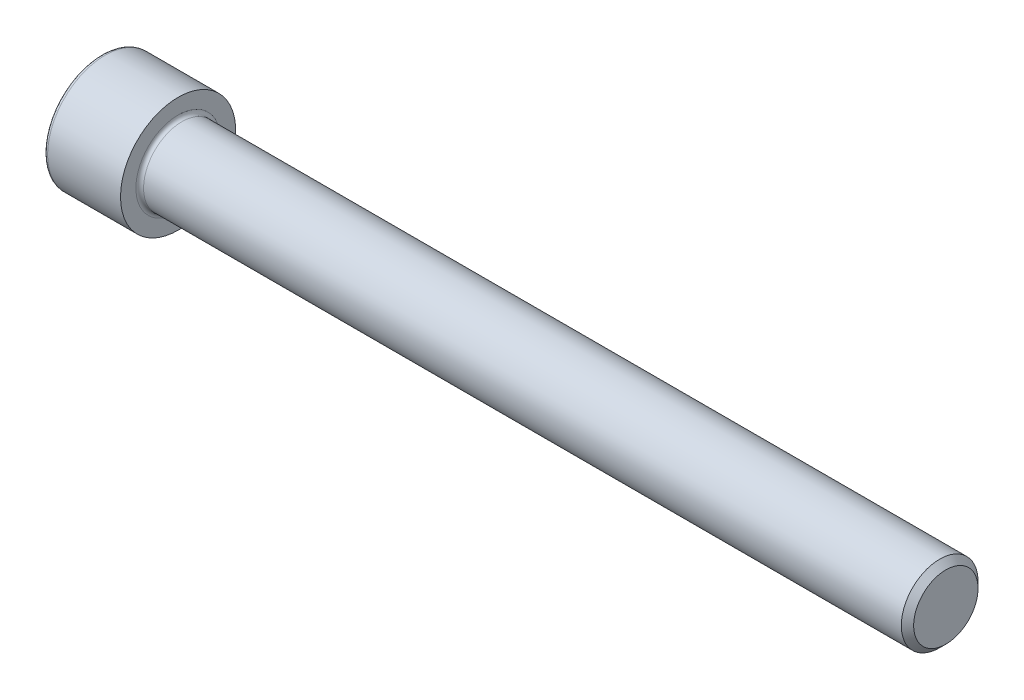
ISO-10303-21;
HEADER;
FILE_DESCRIPTION(('STEP AP214'),'2;1');
FILE_NAME('part.step','',(''),(''),'','','');
FILE_SCHEMA(('AUTOMOTIVE_DESIGN { 1 0 10303 214 1 1 1 1 }'));
ENDSEC;
DATA;
#1=APPLICATION_CONTEXT('core data for automotive mechanical design processes');
#2=APPLICATION_PROTOCOL_DEFINITION('international standard','automotive_design',2000,#1);
#3=PRODUCT_CONTEXT('',#1,'mechanical');
#4=PRODUCT('Part','Part','',(#3));
#5=PRODUCT_RELATED_PRODUCT_CATEGORY('part','',(#4));
#6=PRODUCT_DEFINITION_FORMATION('','',#4);
#7=PRODUCT_DEFINITION_CONTEXT('part definition',#1,'design');
#8=PRODUCT_DEFINITION('design','',#6,#7);
#9=PRODUCT_DEFINITION_SHAPE('','',#8);
#10=(LENGTH_UNIT() NAMED_UNIT(*) SI_UNIT(.MILLI.,.METRE.));
#11=(NAMED_UNIT(*) PLANE_ANGLE_UNIT() SI_UNIT($,.RADIAN.));
#12=(NAMED_UNIT(*) SI_UNIT($,.STERADIAN.) SOLID_ANGLE_UNIT());
#13=UNCERTAINTY_MEASURE_WITH_UNIT(LENGTH_MEASURE(1.E-05),#10,'distance_accuracy_value','');
#14=(GEOMETRIC_REPRESENTATION_CONTEXT(3) GLOBAL_UNCERTAINTY_ASSIGNED_CONTEXT((#13)) GLOBAL_UNIT_ASSIGNED_CONTEXT((#10,
#11,#12)) REPRESENTATION_CONTEXT('',''));
#15=CARTESIAN_POINT('',(0.,0.,0.));
#16=DIRECTION('',(0.,0.,1.));
#17=DIRECTION('',(1.,0.,0.));
#18=AXIS2_PLACEMENT_3D('',#15,#16,#17);
#19=CARTESIAN_POINT('',(0.,0.,0.));
#20=DIRECTION('',(-1.,0.,0.));
#21=DIRECTION('',(0.,0.,1.));
#22=AXIS2_PLACEMENT_3D('',#19,#20,#21);
#23=PLANE('',#22);
#24=DIRECTION('',(0.,-0.499999999999998,0.866025403784439));
#25=VECTOR('',#24,1.);
#26=CARTESIAN_POINT('',(0.,5.83989797285307,0.));
#27=LINE('',#26,#25);
#28=CARTESIAN_POINT('',(0.,5.83989797285307,0.));
#29=VERTEX_POINT('',#28);
#30=CARTESIAN_POINT('',(0.,2.91994898642654,5.0575));
#31=VERTEX_POINT('',#30);
#32=EDGE_CURVE('E262',#29,#31,#27,.T.);
#33=ORIENTED_EDGE('',*,*,#32,.T.);
#34=DIRECTION('',(0.,1.,0.));
#35=VECTOR('',#34,1.);
#36=CARTESIAN_POINT('',(0.,-2.91994898642652,5.0575));
#37=LINE('',#36,#35);
#38=CARTESIAN_POINT('',(0.,-2.91994898642652,5.0575));
#39=VERTEX_POINT('',#38);
#40=EDGE_CURVE('E134',#39,#31,#37,.T.);
#41=ORIENTED_EDGE('',*,*,#40,.F.);
#42=DIRECTION('',(0.,-0.500000000000001,-0.866025403784438));
#43=VECTOR('',#42,1.);
#44=CARTESIAN_POINT('',(0.,-2.91994898642652,5.0575));
#45=LINE('',#44,#43);
#46=CARTESIAN_POINT('',(0.,-5.83989797285306,0.));
#47=VERTEX_POINT('',#46);
#48=EDGE_CURVE('E265',#39,#47,#45,.T.);
#49=ORIENTED_EDGE('',*,*,#48,.T.);
#50=DIRECTION('',(0.,0.499999999999998,-0.86602540378444));
#51=VECTOR('',#50,1.);
#52=CARTESIAN_POINT('',(0.,-5.83989797285306,0.));
#53=LINE('',#52,#51);
#54=CARTESIAN_POINT('',(0.,-2.91994898642653,-5.0575));
#55=VERTEX_POINT('',#54);
#56=EDGE_CURVE('E268',#47,#55,#53,.T.);
#57=ORIENTED_EDGE('',*,*,#56,.T.);
#58=DIRECTION('',(0.,-1.,0.));
#59=VECTOR('',#58,1.);
#60=CARTESIAN_POINT('',(0.,2.91994898642653,-5.0575));
#61=LINE('',#60,#59);
#62=CARTESIAN_POINT('',(0.,2.91994898642653,-5.0575));
#63=VERTEX_POINT('',#62);
#64=EDGE_CURVE('E271',#63,#55,#61,.T.);
#65=ORIENTED_EDGE('',*,*,#64,.F.);
#66=DIRECTION('',(0.,-0.500000000000001,-0.866025403784438));
#67=VECTOR('',#66,1.);
#68=CARTESIAN_POINT('',(0.,5.83989797285307,0.));
#69=LINE('',#68,#67);
#70=EDGE_CURVE('E129',#29,#63,#69,.T.);
#71=ORIENTED_EDGE('',*,*,#70,.F.);
#72=EDGE_LOOP('',(#33,#41,#49,#57,#65,#71));
#73=FACE_BOUND('',#72,.T.);
#74=CARTESIAN_POINT('',(0.,0.,0.));
#75=DIRECTION('',(-1.,0.,0.));
#76=DIRECTION('',(0.,0.,1.));
#77=AXIS2_PLACEMENT_3D('',#74,#75,#76);
#78=CIRCLE('',#77,8.4);
#79=CARTESIAN_POINT('',(0.,0.,8.4));
#80=VERTEX_POINT('',#79);
#81=EDGE_CURVE('E46',#80,#80,#78,.T.);
#82=ORIENTED_EDGE('',*,*,#81,.T.);
#83=EDGE_LOOP('',(#82));
#84=FACE_BOUND('',#83,.T.);
#85=ADVANCED_FACE('F38',(#73,#84),#23,.T.);
#86=CARTESIAN_POINT('',(-31.75,0.,0.));
#87=DIRECTION('',(-1.,0.,0.));
#88=DIRECTION('',(0.,0.,1.));
#89=AXIS2_PLACEMENT_3D('',#86,#87,#88);
#90=CYLINDRICAL_SURFACE('',#89,9.);
#91=CARTESIAN_POINT('',(0.600000000000003,0.,0.));
#92=DIRECTION('',(-1.,0.,0.));
#93=DIRECTION('',(0.,0.,1.));
#94=AXIS2_PLACEMENT_3D('',#91,#92,#93);
#95=CIRCLE('',#94,9.);
#96=CARTESIAN_POINT('',(0.600000000000003,0.,9.));
#97=VERTEX_POINT('',#96);
#98=EDGE_CURVE('E11',#97,#97,#95,.F.);
#99=ORIENTED_EDGE('',*,*,#98,.T.);
#100=EDGE_LOOP('',(#99));
#101=FACE_BOUND('',#100,.T.);
#102=CARTESIAN_POINT('',(12.,0.,0.));
#103=DIRECTION('',(-1.,0.,0.));
#104=DIRECTION('',(0.,0.,1.));
#105=AXIS2_PLACEMENT_3D('',#102,#103,#104);
#106=CIRCLE('',#105,9.);
#107=CARTESIAN_POINT('',(12.,0.,9.));
#108=VERTEX_POINT('',#107);
#109=EDGE_CURVE('E152',#108,#108,#106,.T.);
#110=ORIENTED_EDGE('',*,*,#109,.T.);
#111=EDGE_LOOP('',(#110));
#112=FACE_BOUND('',#111,.T.);
#113=ADVANCED_FACE('F176',(#101,#112),#90,.T.);
#114=CARTESIAN_POINT('',(12.,9.,0.));
#115=DIRECTION('',(1.,0.,0.));
#116=DIRECTION('',(0.,0.,-1.));
#117=AXIS2_PLACEMENT_3D('',#114,#115,#116);
#118=PLANE('',#117);
#119=CARTESIAN_POINT('',(12.,0.,0.));
#120=DIRECTION('',(1.,0.,0.));
#121=DIRECTION('',(0.,0.,-1.));
#122=AXIS2_PLACEMENT_3D('',#119,#120,#121);
#123=CIRCLE('',#122,6.6);
#124=CARTESIAN_POINT('',(12.,0.,-6.6));
#125=VERTEX_POINT('',#124);
#126=EDGE_CURVE('E155',#125,#125,#123,.F.);
#127=ORIENTED_EDGE('',*,*,#126,.T.);
#128=EDGE_LOOP('',(#127));
#129=FACE_BOUND('',#128,.T.);
#130=ORIENTED_EDGE('',*,*,#109,.F.);
#131=EDGE_LOOP('',(#130));
#132=FACE_BOUND('',#131,.T.);
#133=ADVANCED_FACE('F182',(#129,#132),#118,.T.);
#134=CARTESIAN_POINT('',(-31.75,0.,0.));
#135=DIRECTION('',(-1.,0.,0.));
#136=DIRECTION('',(0.,0.,1.));
#137=AXIS2_PLACEMENT_3D('',#134,#135,#136);
#138=CYLINDRICAL_SURFACE('',#137,6.);
#139=CARTESIAN_POINT('',(12.6,0.,0.));
#140=DIRECTION('',(1.,0.,0.));
#141=DIRECTION('',(0.,0.,-1.));
#142=AXIS2_PLACEMENT_3D('',#139,#140,#141);
#143=CIRCLE('',#142,6.);
#144=CARTESIAN_POINT('',(12.6,0.,-6.));
#145=VERTEX_POINT('',#144);
#146=EDGE_CURVE('E158',#145,#145,#143,.T.);
#147=ORIENTED_EDGE('',*,*,#146,.T.);
#148=EDGE_LOOP('',(#147));
#149=FACE_BOUND('',#148,.T.);
#150=CARTESIAN_POINT('',(131.036,0.,0.));
#151=DIRECTION('',(-1.,0.,0.));
#152=DIRECTION('',(0.,0.,1.));
#153=AXIS2_PLACEMENT_3D('',#150,#151,#152);
#154=CIRCLE('',#153,6.);
#155=CARTESIAN_POINT('',(131.036,0.,6.));
#156=VERTEX_POINT('',#155);
#157=EDGE_CURVE('E149',#156,#156,#154,.T.);
#158=ORIENTED_EDGE('',*,*,#157,.T.);
#159=EDGE_LOOP('',(#158));
#160=FACE_BOUND('',#159,.T.);
#161=ADVANCED_FACE('F188',(#149,#160),#138,.T.);
#162=CARTESIAN_POINT('',(132.,0.,0.));
#163=DIRECTION('',(-1.,0.,0.));
#164=DIRECTION('',(0.,0.,1.));
#165=AXIS2_PLACEMENT_3D('',#162,#163,#164);
#166=CONICAL_SURFACE('',#165,5.036,0.785398163397468);
#167=ORIENTED_EDGE('',*,*,#157,.F.);
#168=EDGE_LOOP('',(#167));
#169=FACE_BOUND('',#168,.T.);
#170=CARTESIAN_POINT('',(132.,0.,0.));
#171=DIRECTION('',(-1.,0.,0.));
#172=DIRECTION('',(0.,0.,1.));
#173=AXIS2_PLACEMENT_3D('',#170,#171,#172);
#174=CIRCLE('',#173,5.036);
#175=CARTESIAN_POINT('',(132.,0.,5.036));
#176=VERTEX_POINT('',#175);
#177=EDGE_CURVE('E145',#176,#176,#174,.T.);
#178=ORIENTED_EDGE('',*,*,#177,.T.);
#179=EDGE_LOOP('',(#178));
#180=FACE_BOUND('',#179,.T.);
#181=ADVANCED_FACE('F192',(#169,#180),#166,.T.);
#182=CARTESIAN_POINT('',(132.,5.036,0.));
#183=DIRECTION('',(1.,0.,0.));
#184=DIRECTION('',(0.,0.,-1.));
#185=AXIS2_PLACEMENT_3D('',#182,#183,#184);
#186=PLANE('',#185);
#187=ORIENTED_EDGE('',*,*,#177,.F.);
#188=EDGE_LOOP('',(#187));
#189=FACE_BOUND('',#188,.T.);
#190=ADVANCED_FACE('F172',(#189),#186,.T.);
#191=CARTESIAN_POINT('',(12.6,0.,0.));
#192=DIRECTION('',(1.,0.,0.));
#193=DIRECTION('',(0.,0.,-1.));
#194=AXIS2_PLACEMENT_3D('',#191,#192,#193);
#195=TOROIDAL_SURFACE('',#194,6.6,0.6);
#196=ORIENTED_EDGE('',*,*,#146,.F.);
#197=EDGE_LOOP('',(#196));
#198=FACE_BOUND('',#197,.T.);
#199=ORIENTED_EDGE('',*,*,#126,.F.);
#200=EDGE_LOOP('',(#199));
#201=FACE_BOUND('',#200,.T.);
#202=ADVANCED_FACE('F165',(#198,#201),#195,.F.);
#203=CARTESIAN_POINT('',(0.600000000000003,0.,0.));
#204=DIRECTION('',(-1.,0.,0.));
#205=DIRECTION('',(0.,0.,1.));
#206=AXIS2_PLACEMENT_3D('',#203,#204,#205);
#207=TOROIDAL_SURFACE('',#206,8.4,0.6);
#208=ORIENTED_EDGE('',*,*,#98,.F.);
#209=EDGE_LOOP('',(#208));
#210=FACE_BOUND('',#209,.T.);
#211=ORIENTED_EDGE('',*,*,#81,.F.);
#212=EDGE_LOOP('',(#211));
#213=FACE_BOUND('',#212,.T.);
#214=ADVANCED_FACE('F40',(#210,#213),#207,.T.);
#215=CARTESIAN_POINT('',(6.,5.83989797285307,0.));
#216=DIRECTION('',(0.,-0.866025403784439,-0.499999999999999));
#217=DIRECTION('',(0.,0.499999999999999,-0.866025403784439));
#218=AXIS2_PLACEMENT_3D('',#215,#216,#217);
#219=PLANE('',#218);
#220=ORIENTED_EDGE('',*,*,#32,.F.);
#221=DIRECTION('',(-1.,0.,0.));
#222=VECTOR('',#221,1.);
#223=CARTESIAN_POINT('',(6.,5.83989797285307,0.));
#224=LINE('',#223,#222);
#225=CARTESIAN_POINT('',(6.,5.83989797285307,0.));
#226=VERTEX_POINT('',#225);
#227=EDGE_CURVE('E252',#226,#29,#224,.T.);
#228=ORIENTED_EDGE('',*,*,#227,.F.);
#229=DIRECTION('',(0.,-0.499999999999998,0.866025403784439));
#230=VECTOR('',#229,1.);
#231=CARTESIAN_POINT('',(6.,5.83989797285307,0.));
#232=LINE('',#231,#230);
#233=CARTESIAN_POINT('',(6.,4.3799234796398,2.52874999999999));
#234=VERTEX_POINT('',#233);
#235=EDGE_CURVE('E121',#226,#234,#232,.T.);
#236=ORIENTED_EDGE('',*,*,#235,.T.);
#237=CARTESIAN_POINT('',(6.,2.91994898642654,5.0575));
#238=VERTEX_POINT('',#237);
#239=EDGE_CURVE('E112',#234,#238,#232,.T.);
#240=ORIENTED_EDGE('',*,*,#239,.T.);
#241=DIRECTION('',(-1.,0.,0.));
#242=VECTOR('',#241,1.);
#243=CARTESIAN_POINT('',(6.,2.91994898642654,5.0575));
#244=LINE('',#243,#242);
#245=EDGE_CURVE('E126',#238,#31,#244,.T.);
#246=ORIENTED_EDGE('',*,*,#245,.T.);
#247=EDGE_LOOP('',(#220,#228,#236,#240,#246));
#248=FACE_BOUND('',#247,.T.);
#249=ADVANCED_FACE('F125',(#248),#219,.T.);
#250=CARTESIAN_POINT('',(6.,-2.91994898642652,5.0575));
#251=DIRECTION('',(0.,0.,1.));
#252=DIRECTION('',(0.,-1.,0.));
#253=AXIS2_PLACEMENT_3D('',#250,#251,#252);
#254=PLANE('',#253);
#255=ORIENTED_EDGE('',*,*,#40,.T.);
#256=ORIENTED_EDGE('',*,*,#245,.F.);
#257=DIRECTION('',(0.,1.,0.));
#258=VECTOR('',#257,1.);
#259=CARTESIAN_POINT('',(6.,-2.91994898642652,5.0575));
#260=LINE('',#259,#258);
#261=CARTESIAN_POINT('',(6.,0.,5.0575));
#262=VERTEX_POINT('',#261);
#263=EDGE_CURVE('E109',#262,#238,#260,.T.);
#264=ORIENTED_EDGE('',*,*,#263,.F.);
#265=CARTESIAN_POINT('',(6.,-2.91994898642652,5.0575));
#266=VERTEX_POINT('',#265);
#267=EDGE_CURVE('E120',#266,#262,#260,.T.);
#268=ORIENTED_EDGE('',*,*,#267,.F.);
#269=DIRECTION('',(-1.,0.,0.));
#270=VECTOR('',#269,1.);
#271=CARTESIAN_POINT('',(6.,-2.91994898642652,5.0575));
#272=LINE('',#271,#270);
#273=EDGE_CURVE('E136',#266,#39,#272,.T.);
#274=ORIENTED_EDGE('',*,*,#273,.T.);
#275=EDGE_LOOP('',(#255,#256,#264,#268,#274));
#276=FACE_BOUND('',#275,.T.);
#277=ADVANCED_FACE('F131',(#276),#254,.F.);
#278=CARTESIAN_POINT('',(6.,-2.91994898642652,5.0575));
#279=DIRECTION('',(0.,0.866025403784438,-0.500000000000001));
#280=DIRECTION('',(0.,0.500000000000001,0.866025403784438));
#281=AXIS2_PLACEMENT_3D('',#278,#279,#280);
#282=PLANE('',#281);
#283=ORIENTED_EDGE('',*,*,#48,.F.);
#284=ORIENTED_EDGE('',*,*,#273,.F.);
#285=DIRECTION('',(0.,-0.500000000000001,-0.866025403784438));
#286=VECTOR('',#285,1.);
#287=CARTESIAN_POINT('',(6.,-2.91994898642652,5.0575));
#288=LINE('',#287,#286);
#289=CARTESIAN_POINT('',(6.,-4.37992347963979,2.52875));
#290=VERTEX_POINT('',#289);
#291=EDGE_CURVE('E291',#266,#290,#288,.T.);
#292=ORIENTED_EDGE('',*,*,#291,.T.);
#293=CARTESIAN_POINT('',(6.,-5.83989797285306,0.));
#294=VERTEX_POINT('',#293);
#295=EDGE_CURVE('E280',#290,#294,#288,.T.);
#296=ORIENTED_EDGE('',*,*,#295,.T.);
#297=DIRECTION('',(-1.,0.,0.));
#298=VECTOR('',#297,1.);
#299=CARTESIAN_POINT('',(6.,-5.83989797285306,0.));
#300=LINE('',#299,#298);
#301=EDGE_CURVE('E141',#294,#47,#300,.T.);
#302=ORIENTED_EDGE('',*,*,#301,.T.);
#303=EDGE_LOOP('',(#283,#284,#292,#296,#302));
#304=FACE_BOUND('',#303,.T.);
#305=ADVANCED_FACE('F206',(#304),#282,.T.);
#306=CARTESIAN_POINT('',(6.,-5.83989797285306,0.));
#307=DIRECTION('',(0.,0.86602540378444,0.499999999999998));
#308=DIRECTION('',(0.,-0.499999999999998,0.86602540378444));
#309=AXIS2_PLACEMENT_3D('',#306,#307,#308);
#310=PLANE('',#309);
#311=ORIENTED_EDGE('',*,*,#56,.F.);
#312=ORIENTED_EDGE('',*,*,#301,.F.);
#313=DIRECTION('',(0.,0.499999999999998,-0.86602540378444));
#314=VECTOR('',#313,1.);
#315=CARTESIAN_POINT('',(6.,-5.83989797285306,0.));
#316=LINE('',#315,#314);
#317=CARTESIAN_POINT('',(6.,-4.3799234796398,-2.52874999999999));
#318=VERTEX_POINT('',#317);
#319=EDGE_CURVE('E258',#294,#318,#316,.T.);
#320=ORIENTED_EDGE('',*,*,#319,.T.);
#321=CARTESIAN_POINT('',(6.,-2.91994898642653,-5.0575));
#322=VERTEX_POINT('',#321);
#323=EDGE_CURVE('E290',#318,#322,#316,.T.);
#324=ORIENTED_EDGE('',*,*,#323,.T.);
#325=DIRECTION('',(-1.,0.,0.));
#326=VECTOR('',#325,1.);
#327=CARTESIAN_POINT('',(6.,-2.91994898642653,-5.0575));
#328=LINE('',#327,#326);
#329=EDGE_CURVE('E251',#322,#55,#328,.T.);
#330=ORIENTED_EDGE('',*,*,#329,.T.);
#331=EDGE_LOOP('',(#311,#312,#320,#324,#330));
#332=FACE_BOUND('',#331,.T.);
#333=ADVANCED_FACE('F209',(#332),#310,.T.);
#334=CARTESIAN_POINT('',(6.,2.91994898642653,-5.0575));
#335=DIRECTION('',(0.,0.,-1.));
#336=DIRECTION('',(0.,1.,0.));
#337=AXIS2_PLACEMENT_3D('',#334,#335,#336);
#338=PLANE('',#337);
#339=ORIENTED_EDGE('',*,*,#64,.T.);
#340=ORIENTED_EDGE('',*,*,#329,.F.);
#341=DIRECTION('',(0.,-1.,0.));
#342=VECTOR('',#341,1.);
#343=CARTESIAN_POINT('',(6.,2.91994898642653,-5.0575));
#344=LINE('',#343,#342);
#345=CARTESIAN_POINT('',(6.,0.,-5.0575));
#346=VERTEX_POINT('',#345);
#347=EDGE_CURVE('E255',#346,#322,#344,.T.);
#348=ORIENTED_EDGE('',*,*,#347,.F.);
#349=CARTESIAN_POINT('',(6.,2.91994898642653,-5.0575));
#350=VERTEX_POINT('',#349);
#351=EDGE_CURVE('E53',#350,#346,#344,.T.);
#352=ORIENTED_EDGE('',*,*,#351,.F.);
#353=DIRECTION('',(-1.,0.,0.));
#354=VECTOR('',#353,1.);
#355=CARTESIAN_POINT('',(6.,2.91994898642653,-5.0575));
#356=LINE('',#355,#354);
#357=EDGE_CURVE('E248',#350,#63,#356,.T.);
#358=ORIENTED_EDGE('',*,*,#357,.T.);
#359=EDGE_LOOP('',(#339,#340,#348,#352,#358));
#360=FACE_BOUND('',#359,.T.);
#361=ADVANCED_FACE('F213',(#360),#338,.F.);
#362=CARTESIAN_POINT('',(6.,5.83989797285307,0.));
#363=DIRECTION('',(0.,0.866025403784438,-0.500000000000001));
#364=DIRECTION('',(0.,0.500000000000001,0.866025403784438));
#365=AXIS2_PLACEMENT_3D('',#362,#363,#364);
#366=PLANE('',#365);
#367=ORIENTED_EDGE('',*,*,#70,.T.);
#368=ORIENTED_EDGE('',*,*,#357,.F.);
#369=DIRECTION('',(0.,-0.500000000000001,-0.866025403784438));
#370=VECTOR('',#369,1.);
#371=CARTESIAN_POINT('',(6.,5.83989797285307,0.));
#372=LINE('',#371,#370);
#373=CARTESIAN_POINT('',(6.,4.3799234796398,-2.52875000000001));
#374=VERTEX_POINT('',#373);
#375=EDGE_CURVE('E238',#374,#350,#372,.T.);
#376=ORIENTED_EDGE('',*,*,#375,.F.);
#377=EDGE_CURVE('E244',#226,#374,#372,.T.);
#378=ORIENTED_EDGE('',*,*,#377,.F.);
#379=ORIENTED_EDGE('',*,*,#227,.T.);
#380=EDGE_LOOP('',(#367,#368,#376,#378,#379));
#381=FACE_BOUND('',#380,.T.);
#382=ADVANCED_FACE('F217',(#381),#366,.F.);
#383=CARTESIAN_POINT('',(6.,8.75984695927959,-5.05750000000001));
#384=DIRECTION('',(1.,0.,0.));
#385=DIRECTION('',(0.,0.,-1.));
#386=AXIS2_PLACEMENT_3D('',#383,#384,#385);
#387=PLANE('',#386);
#388=ORIENTED_EDGE('',*,*,#347,.T.);
#389=ORIENTED_EDGE('',*,*,#323,.F.);
#390=CARTESIAN_POINT('',(6.,0.,0.));
#391=DIRECTION('',(-1.,0.,0.));
#392=DIRECTION('',(0.,0.,1.));
#393=AXIS2_PLACEMENT_3D('',#390,#391,#392);
#394=CIRCLE('',#393,5.0575);
#395=EDGE_CURVE('E286',#346,#318,#394,.T.);
#396=ORIENTED_EDGE('',*,*,#395,.F.);
#397=EDGE_LOOP('',(#388,#389,#396));
#398=FACE_BOUND('',#397,.T.);
#399=ADVANCED_FACE('F221',(#398),#387,.F.);
#400=ORIENTED_EDGE('',*,*,#319,.F.);
#401=ORIENTED_EDGE('',*,*,#295,.F.);
#402=EDGE_CURVE('E139',#318,#290,#394,.T.);
#403=ORIENTED_EDGE('',*,*,#402,.F.);
#404=EDGE_LOOP('',(#400,#401,#403));
#405=FACE_BOUND('',#404,.T.);
#406=ADVANCED_FACE('F224',(#405),#387,.F.);
#407=ORIENTED_EDGE('',*,*,#291,.F.);
#408=ORIENTED_EDGE('',*,*,#267,.T.);
#409=EDGE_CURVE('E135',#290,#262,#394,.T.);
#410=ORIENTED_EDGE('',*,*,#409,.F.);
#411=EDGE_LOOP('',(#407,#408,#410));
#412=FACE_BOUND('',#411,.T.);
#413=ADVANCED_FACE('F229',(#412),#387,.F.);
#414=ORIENTED_EDGE('',*,*,#263,.T.);
#415=ORIENTED_EDGE('',*,*,#239,.F.);
#416=EDGE_CURVE('E115',#262,#234,#394,.T.);
#417=ORIENTED_EDGE('',*,*,#416,.F.);
#418=EDGE_LOOP('',(#414,#415,#417));
#419=FACE_BOUND('',#418,.T.);
#420=ADVANCED_FACE('F111',(#419),#387,.F.);
#421=ORIENTED_EDGE('',*,*,#235,.F.);
#422=ORIENTED_EDGE('',*,*,#377,.T.);
#423=EDGE_CURVE('E146',#234,#374,#394,.T.);
#424=ORIENTED_EDGE('',*,*,#423,.F.);
#425=EDGE_LOOP('',(#421,#422,#424));
#426=FACE_BOUND('',#425,.T.);
#427=ADVANCED_FACE('F232',(#426),#387,.F.);
#428=ORIENTED_EDGE('',*,*,#375,.T.);
#429=ORIENTED_EDGE('',*,*,#351,.T.);
#430=EDGE_CURVE('E241',#374,#346,#394,.T.);
#431=ORIENTED_EDGE('',*,*,#430,.F.);
#432=EDGE_LOOP('',(#428,#429,#431));
#433=FACE_BOUND('',#432,.T.);
#434=ADVANCED_FACE('F202',(#433),#387,.F.);
#435=CARTESIAN_POINT('',(6.,0.,0.));
#436=DIRECTION('',(-1.,0.,0.));
#437=DIRECTION('',(0.,0.,1.));
#438=AXIS2_PLACEMENT_3D('',#435,#436,#437);
#439=CONICAL_SURFACE('',#438,5.0575,1.04719755119659);
#440=CARTESIAN_POINT('',(8.91994898642657,0.,0.));
#441=VERTEX_POINT('',#440);
#442=VERTEX_LOOP('',#441);
#443=FACE_BOUND('',#442,.T.);
#444=ORIENTED_EDGE('',*,*,#416,.T.);
#445=ORIENTED_EDGE('',*,*,#423,.T.);
#446=ORIENTED_EDGE('',*,*,#430,.T.);
#447=ORIENTED_EDGE('',*,*,#395,.T.);
#448=ORIENTED_EDGE('',*,*,#402,.T.);
#449=ORIENTED_EDGE('',*,*,#409,.T.);
#450=EDGE_LOOP('',(#444,#445,#446,#447,#448,#449));
#451=FACE_BOUND('',#450,.T.);
#452=ADVANCED_FACE('F200',(#443,#451),#439,.F.);
#453=CLOSED_SHELL('',(#85,#113,#133,#161,#181,#190,#202,#214,#249,#277,#305,#333,#361,#382,#399,
#406,#413,#420,#427,#434,#452));
#454=MANIFOLD_SOLID_BREP('B2',#453);
#455=ADVANCED_BREP_SHAPE_REPRESENTATION('',(#18,#454),#14);
#456=SHAPE_DEFINITION_REPRESENTATION(#9,#455);
ENDSEC;
END-ISO-10303-21;
